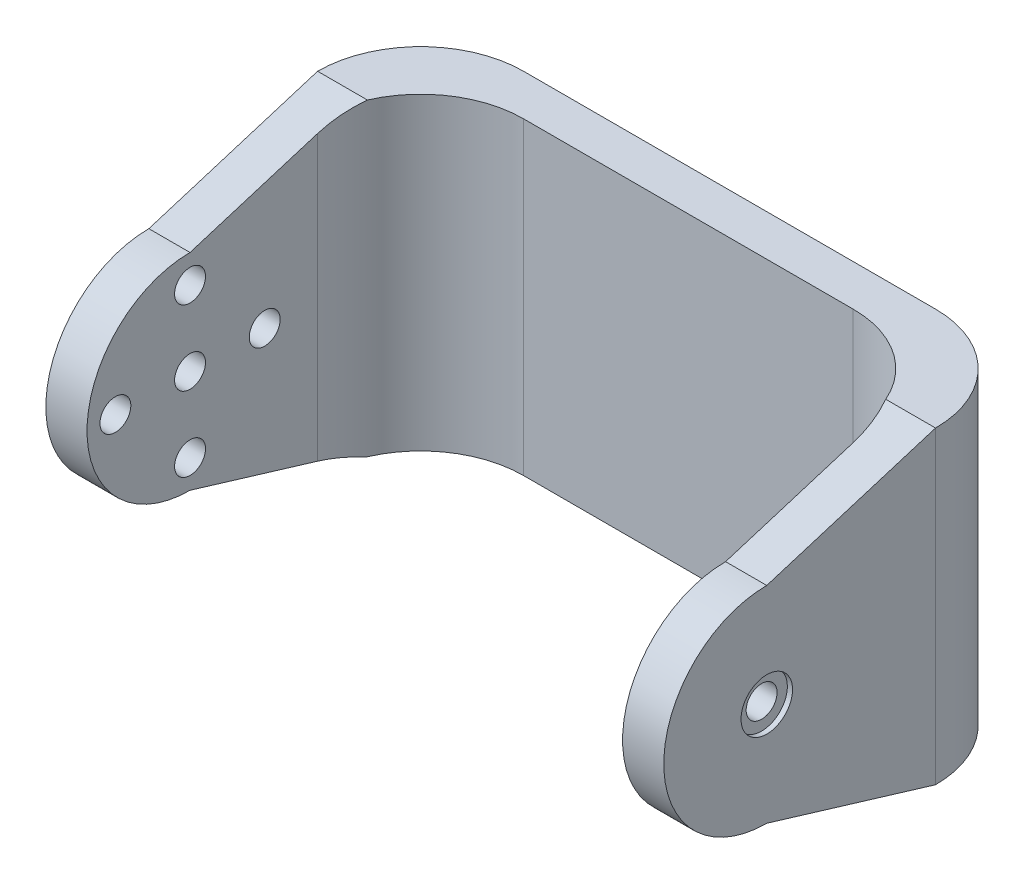
ISO-10303-21;
HEADER;
FILE_DESCRIPTION(('STEP AP214'),'2;1');
FILE_NAME('part.step','',(''),(''),'','','');
FILE_SCHEMA(('AUTOMOTIVE_DESIGN { 1 0 10303 214 1 1 1 1 }'));
ENDSEC;
DATA;
#1=APPLICATION_CONTEXT('core data for automotive mechanical design processes');
#2=APPLICATION_PROTOCOL_DEFINITION('international standard','automotive_design',2000,#1);
#3=PRODUCT_CONTEXT('',#1,'mechanical');
#4=PRODUCT('Part','Part','',(#3));
#5=PRODUCT_RELATED_PRODUCT_CATEGORY('part','',(#4));
#6=PRODUCT_DEFINITION_FORMATION('','',#4);
#7=PRODUCT_DEFINITION_CONTEXT('part definition',#1,'design');
#8=PRODUCT_DEFINITION('design','',#6,#7);
#9=PRODUCT_DEFINITION_SHAPE('','',#8);
#10=(LENGTH_UNIT() NAMED_UNIT(*) SI_UNIT(.MILLI.,.METRE.));
#11=(NAMED_UNIT(*) PLANE_ANGLE_UNIT() SI_UNIT($,.RADIAN.));
#12=(NAMED_UNIT(*) SI_UNIT($,.STERADIAN.) SOLID_ANGLE_UNIT());
#13=UNCERTAINTY_MEASURE_WITH_UNIT(LENGTH_MEASURE(1.E-05),#10,'distance_accuracy_value','');
#14=(GEOMETRIC_REPRESENTATION_CONTEXT(3) GLOBAL_UNCERTAINTY_ASSIGNED_CONTEXT((#13)) GLOBAL_UNIT_ASSIGNED_CONTEXT((#10,
#11,#12)) REPRESENTATION_CONTEXT('',''));
#15=CARTESIAN_POINT('',(0.,0.,0.));
#16=DIRECTION('',(0.,0.,1.));
#17=DIRECTION('',(1.,0.,0.));
#18=AXIS2_PLACEMENT_3D('',#15,#16,#17);
#19=CARTESIAN_POINT('',(19.4462482017696,14.9550555286349,4.24471382344648));
#20=DIRECTION('',(1.,0.,0.));
#21=DIRECTION('',(0.,0.,-1.));
#22=AXIS2_PLACEMENT_3D('',#19,#20,#21);
#23=CYLINDRICAL_SURFACE('',#22,1.5);
#24=CARTESIAN_POINT('',(23.6888888888889,14.9550555286349,4.24471382344647));
#25=DIRECTION('',(1.,0.,0.));
#26=DIRECTION('',(0.,0.,-1.));
#27=AXIS2_PLACEMENT_3D('',#24,#25,#26);
#28=CIRCLE('',#27,1.5);
#29=CARTESIAN_POINT('',(23.6888888888889,14.9550555286349,2.74471382344647));
#30=VERTEX_POINT('',#29);
#31=EDGE_CURVE('E257',#30,#30,#28,.F.);
#32=ORIENTED_EDGE('',*,*,#31,.T.);
#33=EDGE_LOOP('',(#32));
#34=FACE_BOUND('',#33,.T.);
#35=CARTESIAN_POINT('',(27.1888888888889,14.9550555286349,4.24471382344647));
#36=DIRECTION('',(1.,0.,0.));
#37=DIRECTION('',(0.,0.,-1.));
#38=AXIS2_PLACEMENT_3D('',#35,#36,#37);
#39=CIRCLE('',#38,1.5);
#40=CARTESIAN_POINT('',(27.1888888888889,14.9550555286349,2.74471382344647));
#41=VERTEX_POINT('',#40);
#42=EDGE_CURVE('E41',#41,#41,#39,.F.);
#43=ORIENTED_EDGE('',*,*,#42,.F.);
#44=EDGE_LOOP('',(#43));
#45=FACE_BOUND('',#44,.T.);
#46=ADVANCED_FACE('F37',(#34,#45),#23,.F.);
#47=CARTESIAN_POINT('',(27.6888888888889,30.,-22.1422222222222));
#48=DIRECTION('',(-1.,0.,0.));
#49=DIRECTION('',(0.,0.,1.));
#50=AXIS2_PLACEMENT_3D('',#47,#48,#49);
#51=PLANE('',#50);
#52=CARTESIAN_POINT('',(27.6888888888889,14.9550555286349,4.24471382344647));
#53=DIRECTION('',(1.,0.,0.));
#54=DIRECTION('',(0.,0.,-1.));
#55=AXIS2_PLACEMENT_3D('',#52,#53,#54);
#56=CIRCLE('',#55,2.5);
#57=CARTESIAN_POINT('',(27.6888888888889,14.9550555286349,1.74471382344647));
#58=VERTEX_POINT('',#57);
#59=EDGE_CURVE('E330',#58,#58,#56,.T.);
#60=ORIENTED_EDGE('',*,*,#59,.F.);
#61=EDGE_LOOP('',(#60));
#62=FACE_BOUND('',#61,.T.);
#63=CARTESIAN_POINT('',(27.6888888888889,14.9550555286349,4.24471382344647));
#64=DIRECTION('',(1.,0.,0.));
#65=DIRECTION('',(0.,0.,1.));
#66=AXIS2_PLACEMENT_3D('',#63,#64,#65);
#67=CIRCLE('',#66,10.);
#68=CARTESIAN_POINT('',(27.6888888888889,24.9550555286349,4.24471382344647));
#69=VERTEX_POINT('',#68);
#70=CARTESIAN_POINT('',(27.6888888888889,4.95505552863485,4.24471382344647));
#71=VERTEX_POINT('',#70);
#72=EDGE_CURVE('E146',#69,#71,#67,.T.);
#73=ORIENTED_EDGE('',*,*,#72,.T.);
#74=DIRECTION('',(0.,-0.289435826143577,-0.957197420882748));
#75=VECTOR('',#74,1.);
#76=CARTESIAN_POINT('',(27.6888888888889,0.,-12.1422222222222));
#77=LINE('',#76,#75);
#78=CARTESIAN_POINT('',(27.6888888888889,0.,-12.1422222222222));
#79=VERTEX_POINT('',#78);
#80=EDGE_CURVE('E167',#71,#79,#77,.T.);
#81=ORIENTED_EDGE('',*,*,#80,.T.);
#82=DIRECTION('',(0.,-1.,0.));
#83=VECTOR('',#82,1.);
#84=CARTESIAN_POINT('',(27.6888888888889,30.,-12.1422222222222));
#85=LINE('',#84,#83);
#86=CARTESIAN_POINT('',(27.6888888888889,30.,-12.1422222222222));
#87=VERTEX_POINT('',#86);
#88=EDGE_CURVE('E164',#79,#87,#85,.F.);
#89=ORIENTED_EDGE('',*,*,#88,.T.);
#90=DIRECTION('',(0.,-0.294235574594655,0.955732926419799));
#91=VECTOR('',#90,1.);
#92=CARTESIAN_POINT('',(27.6888888888889,30.,-12.1422222222222));
#93=LINE('',#92,#91);
#94=EDGE_CURVE('E138',#87,#69,#93,.T.);
#95=ORIENTED_EDGE('',*,*,#94,.T.);
#96=EDGE_LOOP('',(#73,#81,#89,#95));
#97=FACE_BOUND('',#96,.T.);
#98=ADVANCED_FACE('F165',(#62,#97),#51,.F.);
#99=CARTESIAN_POINT('',(-32.3111111111111,30.,-22.1422222222222));
#100=DIRECTION('',(0.,0.,1.));
#101=DIRECTION('',(1.,0.,0.));
#102=AXIS2_PLACEMENT_3D('',#99,#100,#101);
#103=PLANE('',#102);
#104=DIRECTION('',(-1.,0.,0.));
#105=VECTOR('',#104,1.);
#106=CARTESIAN_POINT('',(-32.3111111111111,0.,-22.1422222222222));
#107=LINE('',#106,#105);
#108=CARTESIAN_POINT('',(17.6888888888889,0.,-22.1422222222222));
#109=VERTEX_POINT('',#108);
#110=CARTESIAN_POINT('',(-22.3111111111111,0.,-22.1422222222222));
#111=VERTEX_POINT('',#110);
#112=EDGE_CURVE('E229',#109,#111,#107,.T.);
#113=ORIENTED_EDGE('',*,*,#112,.T.);
#114=DIRECTION('',(0.,-1.,0.));
#115=VECTOR('',#114,1.);
#116=CARTESIAN_POINT('',(-22.3111111111111,30.,-22.1422222222222));
#117=LINE('',#116,#115);
#118=CARTESIAN_POINT('',(-22.3111111111111,30.,-22.1422222222222));
#119=VERTEX_POINT('',#118);
#120=EDGE_CURVE('E193',#111,#119,#117,.F.);
#121=ORIENTED_EDGE('',*,*,#120,.T.);
#122=DIRECTION('',(-1.,0.,0.));
#123=VECTOR('',#122,1.);
#124=CARTESIAN_POINT('',(-32.3111111111111,30.,-22.1422222222222));
#125=LINE('',#124,#123);
#126=CARTESIAN_POINT('',(17.6888888888889,30.,-22.1422222222222));
#127=VERTEX_POINT('',#126);
#128=EDGE_CURVE('E228',#127,#119,#125,.T.);
#129=ORIENTED_EDGE('',*,*,#128,.F.);
#130=DIRECTION('',(0.,-1.,0.));
#131=VECTOR('',#130,1.);
#132=CARTESIAN_POINT('',(17.6888888888889,30.,-22.1422222222222));
#133=LINE('',#132,#131);
#134=EDGE_CURVE('E175',#127,#109,#133,.T.);
#135=ORIENTED_EDGE('',*,*,#134,.T.);
#136=EDGE_LOOP('',(#113,#121,#129,#135));
#137=FACE_BOUND('',#136,.T.);
#138=ADVANCED_FACE('F241',(#137),#103,.F.);
#139=CARTESIAN_POINT('',(-32.3111111111111,30.,16.8577777777778));
#140=DIRECTION('',(1.,0.,0.));
#141=DIRECTION('',(0.,0.,-1.));
#142=AXIS2_PLACEMENT_3D('',#139,#140,#141);
#143=PLANE('',#142);
#144=CARTESIAN_POINT('',(-32.3111111111111,14.9560555286349,-3.00628617655362));
#145=DIRECTION('',(-1.,0.,0.));
#146=DIRECTION('',(0.,0.,1.));
#147=AXIS2_PLACEMENT_3D('',#144,#145,#146);
#148=CIRCLE('',#147,1.5);
#149=CARTESIAN_POINT('',(-32.3111111111111,14.9560555286349,-1.50628617655362));
#150=VERTEX_POINT('',#149);
#151=EDGE_CURVE('E290',#150,#150,#148,.T.);
#152=ORIENTED_EDGE('',*,*,#151,.F.);
#153=EDGE_LOOP('',(#152));
#154=FACE_BOUND('',#153,.T.);
#155=CARTESIAN_POINT('',(-32.3111111111111,14.9550555286349,4.24471382344649));
#156=DIRECTION('',(-1.,0.,0.));
#157=DIRECTION('',(0.,0.,1.));
#158=AXIS2_PLACEMENT_3D('',#155,#156,#157);
#159=CIRCLE('',#158,1.5);
#160=CARTESIAN_POINT('',(-32.3111111111111,14.9550555286349,5.74471382344649));
#161=VERTEX_POINT('',#160);
#162=EDGE_CURVE('E289',#161,#161,#159,.T.);
#163=ORIENTED_EDGE('',*,*,#162,.F.);
#164=EDGE_LOOP('',(#163));
#165=FACE_BOUND('',#164,.T.);
#166=CARTESIAN_POINT('',(-32.3111111111111,7.70505552863486,4.24271382344633));
#167=DIRECTION('',(-1.,0.,0.));
#168=DIRECTION('',(0.,0.,1.));
#169=AXIS2_PLACEMENT_3D('',#166,#167,#168);
#170=CIRCLE('',#169,1.5);
#171=CARTESIAN_POINT('',(-32.3111111111111,7.70505552863486,5.74271382344633));
#172=VERTEX_POINT('',#171);
#173=EDGE_CURVE('E296',#172,#172,#170,.T.);
#174=ORIENTED_EDGE('',*,*,#173,.F.);
#175=EDGE_LOOP('',(#174));
#176=FACE_BOUND('',#175,.T.);
#177=CARTESIAN_POINT('',(-32.3111111111111,22.2050555286349,4.24471382344649));
#178=DIRECTION('',(-1.,0.,0.));
#179=DIRECTION('',(0.,0.,1.));
#180=AXIS2_PLACEMENT_3D('',#177,#178,#179);
#181=CIRCLE('',#180,1.5);
#182=CARTESIAN_POINT('',(-32.3111111111111,22.2050555286349,5.74471382344649));
#183=VERTEX_POINT('',#182);
#184=EDGE_CURVE('E303',#183,#183,#181,.T.);
#185=ORIENTED_EDGE('',*,*,#184,.F.);
#186=EDGE_LOOP('',(#185));
#187=FACE_BOUND('',#186,.T.);
#188=CARTESIAN_POINT('',(-32.3111111111111,14.9540555286348,11.4937138234464));
#189=DIRECTION('',(-1.,0.,0.));
#190=DIRECTION('',(0.,0.,1.));
#191=AXIS2_PLACEMENT_3D('',#188,#189,#190);
#192=CIRCLE('',#191,1.5);
#193=CARTESIAN_POINT('',(-32.3111111111111,14.9540555286348,12.9937138234464));
#194=VERTEX_POINT('',#193);
#195=EDGE_CURVE('E308',#194,#194,#192,.T.);
#196=ORIENTED_EDGE('',*,*,#195,.F.);
#197=EDGE_LOOP('',(#196));
#198=FACE_BOUND('',#197,.T.);
#199=DIRECTION('',(0.,-1.,0.));
#200=VECTOR('',#199,1.);
#201=CARTESIAN_POINT('',(-32.3111111111111,30.,-12.1422222222222));
#202=LINE('',#201,#200);
#203=CARTESIAN_POINT('',(-32.3111111111111,30.,-12.1422222222222));
#204=VERTEX_POINT('',#203);
#205=CARTESIAN_POINT('',(-32.3111111111111,0.,-12.1422222222222));
#206=VERTEX_POINT('',#205);
#207=EDGE_CURVE('E188',#204,#206,#202,.T.);
#208=ORIENTED_EDGE('',*,*,#207,.T.);
#209=DIRECTION('',(0.,-0.289435826143577,-0.957197420882748));
#210=VECTOR('',#209,1.);
#211=CARTESIAN_POINT('',(-32.3111111111111,0.,-12.1422222222222));
#212=LINE('',#211,#210);
#213=CARTESIAN_POINT('',(-32.3111111111111,4.95505552863485,4.24471382344648));
#214=VERTEX_POINT('',#213);
#215=EDGE_CURVE('E147',#214,#206,#212,.T.);
#216=ORIENTED_EDGE('',*,*,#215,.F.);
#217=CARTESIAN_POINT('',(-32.3111111111111,14.9550555286349,4.24471382344649));
#218=DIRECTION('',(1.,0.,0.));
#219=DIRECTION('',(0.,0.,1.));
#220=AXIS2_PLACEMENT_3D('',#217,#218,#219);
#221=CIRCLE('',#220,10.);
#222=CARTESIAN_POINT('',(-32.3111111111111,24.9550555286349,4.24471382344648));
#223=VERTEX_POINT('',#222);
#224=EDGE_CURVE('E256',#223,#214,#221,.T.);
#225=ORIENTED_EDGE('',*,*,#224,.F.);
#226=DIRECTION('',(0.,-0.294235574594655,0.955732926419799));
#227=VECTOR('',#226,1.);
#228=CARTESIAN_POINT('',(-32.3111111111111,30.,-12.1422222222222));
#229=LINE('',#228,#227);
#230=EDGE_CURVE('E254',#204,#223,#229,.T.);
#231=ORIENTED_EDGE('',*,*,#230,.F.);
#232=EDGE_LOOP('',(#208,#216,#225,#231));
#233=FACE_BOUND('',#232,.T.);
#234=ADVANCED_FACE('F251',(#154,#165,#176,#187,#198,#233),#143,.F.);
#235=CARTESIAN_POINT('',(-28.3111111111111,30.,-18.1422222222222));
#236=DIRECTION('',(-1.,0.,0.));
#237=DIRECTION('',(0.,0.,1.));
#238=AXIS2_PLACEMENT_3D('',#235,#236,#237);
#239=PLANE('',#238);
#240=CARTESIAN_POINT('',(-28.3111111111111,14.9560555286349,-3.00628617655362));
#241=DIRECTION('',(-1.,0.,0.));
#242=DIRECTION('',(0.,0.,1.));
#243=AXIS2_PLACEMENT_3D('',#240,#241,#242);
#244=CIRCLE('',#243,1.5);
#245=CARTESIAN_POINT('',(-28.3111111111111,14.9560555286349,-1.50628617655362));
#246=VERTEX_POINT('',#245);
#247=EDGE_CURVE('E234',#246,#246,#244,.F.);
#248=ORIENTED_EDGE('',*,*,#247,.F.);
#249=EDGE_LOOP('',(#248));
#250=FACE_BOUND('',#249,.T.);
#251=CARTESIAN_POINT('',(-28.3111111111111,14.9550555286349,4.24471382344648));
#252=DIRECTION('',(-1.,0.,0.));
#253=DIRECTION('',(0.,0.,1.));
#254=AXIS2_PLACEMENT_3D('',#251,#252,#253);
#255=CIRCLE('',#254,1.5);
#256=CARTESIAN_POINT('',(-28.3111111111111,14.9550555286349,5.74471382344649));
#257=VERTEX_POINT('',#256);
#258=EDGE_CURVE('E300',#257,#257,#255,.F.);
#259=ORIENTED_EDGE('',*,*,#258,.F.);
#260=EDGE_LOOP('',(#259));
#261=FACE_BOUND('',#260,.T.);
#262=CARTESIAN_POINT('',(-28.3111111111111,7.70505552863486,4.24271382344633));
#263=DIRECTION('',(-1.,0.,0.));
#264=DIRECTION('',(0.,0.,1.));
#265=AXIS2_PLACEMENT_3D('',#262,#263,#264);
#266=CIRCLE('',#265,1.5);
#267=CARTESIAN_POINT('',(-28.3111111111111,7.70505552863486,5.74271382344633));
#268=VERTEX_POINT('',#267);
#269=EDGE_CURVE('E299',#268,#268,#266,.F.);
#270=ORIENTED_EDGE('',*,*,#269,.F.);
#271=EDGE_LOOP('',(#270));
#272=FACE_BOUND('',#271,.T.);
#273=CARTESIAN_POINT('',(-28.3111111111111,22.2050555286349,4.24471382344648));
#274=DIRECTION('',(-1.,0.,0.));
#275=DIRECTION('',(0.,0.,1.));
#276=AXIS2_PLACEMENT_3D('',#273,#274,#275);
#277=CIRCLE('',#276,1.5);
#278=CARTESIAN_POINT('',(-28.3111111111111,22.2050555286349,5.74471382344649));
#279=VERTEX_POINT('',#278);
#280=EDGE_CURVE('E311',#279,#279,#277,.F.);
#281=ORIENTED_EDGE('',*,*,#280,.F.);
#282=EDGE_LOOP('',(#281));
#283=FACE_BOUND('',#282,.T.);
#284=CARTESIAN_POINT('',(-28.3111111111111,14.9540555286348,11.4937138234464));
#285=DIRECTION('',(-1.,0.,0.));
#286=DIRECTION('',(0.,0.,1.));
#287=AXIS2_PLACEMENT_3D('',#284,#285,#286);
#288=CIRCLE('',#287,1.5);
#289=CARTESIAN_POINT('',(-28.3111111111111,14.9540555286348,12.9937138234464));
#290=VERTEX_POINT('',#289);
#291=EDGE_CURVE('E293',#290,#290,#288,.F.);
#292=ORIENTED_EDGE('',*,*,#291,.F.);
#293=EDGE_LOOP('',(#292));
#294=FACE_BOUND('',#293,.T.);
#295=CARTESIAN_POINT('',(-28.3111111111111,14.9550555286349,4.24471382344648));
#296=DIRECTION('',(-1.,0.,0.));
#297=DIRECTION('',(0.,0.,1.));
#298=AXIS2_PLACEMENT_3D('',#295,#296,#297);
#299=CIRCLE('',#298,10.);
#300=CARTESIAN_POINT('',(-28.3111111111111,24.9550555286349,4.24471382344648));
#301=VERTEX_POINT('',#300);
#302=CARTESIAN_POINT('',(-28.3111111111111,4.95505552863485,4.24471382344648));
#303=VERTEX_POINT('',#302);
#304=EDGE_CURVE('E286',#301,#303,#299,.F.);
#305=ORIENTED_EDGE('',*,*,#304,.T.);
#306=DIRECTION('',(0.,-0.289435826143577,-0.957197420882748));
#307=VECTOR('',#306,1.);
#308=CARTESIAN_POINT('',(-28.3111111111111,0.85090956588825,-9.32816684861875));
#309=LINE('',#308,#307);
#310=CARTESIAN_POINT('',(-28.3111111111111,1.20951360640589,-8.14222222222222));
#311=VERTEX_POINT('',#310);
#312=EDGE_CURVE('E278',#303,#311,#309,.T.);
#313=ORIENTED_EDGE('',*,*,#312,.T.);
#314=DIRECTION('',(0.,-1.,0.));
#315=VECTOR('',#314,1.);
#316=CARTESIAN_POINT('',(-28.3111111111111,30.,-8.14222222222222));
#317=LINE('',#316,#315);
#318=CARTESIAN_POINT('',(-28.3111111111111,28.768544782916,-8.14222222222222));
#319=VERTEX_POINT('',#318);
#320=EDGE_CURVE('E200',#311,#319,#317,.F.);
#321=ORIENTED_EDGE('',*,*,#320,.T.);
#322=DIRECTION('',(0.,-0.294235574594655,0.955732926419799));
#323=VECTOR('',#322,1.);
#324=CARTESIAN_POINT('',(-28.3111111111111,31.687263760585,-17.6227747820799));
#325=LINE('',#324,#323);
#326=EDGE_CURVE('E61',#319,#301,#325,.T.);
#327=ORIENTED_EDGE('',*,*,#326,.T.);
#328=EDGE_LOOP('',(#305,#313,#321,#327));
#329=FACE_BOUND('',#328,.T.);
#330=ADVANCED_FACE('F393',(#250,#261,#272,#283,#294,#329),#239,.F.);
#331=CARTESIAN_POINT('',(23.6888888888889,30.,-18.1422222222222));
#332=DIRECTION('',(0.,0.,-1.));
#333=DIRECTION('',(-1.,0.,0.));
#334=AXIS2_PLACEMENT_3D('',#331,#332,#333);
#335=PLANE('',#334);
#336=DIRECTION('',(1.,0.,0.));
#337=VECTOR('',#336,1.);
#338=CARTESIAN_POINT('',(23.6888888888889,30.,-18.1422222222222));
#339=LINE('',#338,#337);
#340=CARTESIAN_POINT('',(-18.3111111111111,30.,-18.1422222222222));
#341=VERTEX_POINT('',#340);
#342=CARTESIAN_POINT('',(13.6888888888889,30.,-18.1422222222222));
#343=VERTEX_POINT('',#342);
#344=EDGE_CURVE('E231',#341,#343,#339,.T.);
#345=ORIENTED_EDGE('',*,*,#344,.F.);
#346=DIRECTION('',(0.,-1.,0.));
#347=VECTOR('',#346,1.);
#348=CARTESIAN_POINT('',(-18.3111111111111,0.,-18.1422222222222));
#349=LINE('',#348,#347);
#350=CARTESIAN_POINT('',(-18.3111111111111,0.,-18.1422222222222));
#351=VERTEX_POINT('',#350);
#352=EDGE_CURVE('E197',#341,#351,#349,.T.);
#353=ORIENTED_EDGE('',*,*,#352,.T.);
#354=DIRECTION('',(1.,0.,0.));
#355=VECTOR('',#354,1.);
#356=CARTESIAN_POINT('',(23.6888888888889,0.,-18.1422222222222));
#357=LINE('',#356,#355);
#358=CARTESIAN_POINT('',(13.6888888888889,0.,-18.1422222222222));
#359=VERTEX_POINT('',#358);
#360=EDGE_CURVE('E223',#351,#359,#357,.T.);
#361=ORIENTED_EDGE('',*,*,#360,.T.);
#362=DIRECTION('',(0.,-1.,0.));
#363=VECTOR('',#362,1.);
#364=CARTESIAN_POINT('',(13.6888888888889,30.,-18.1422222222222));
#365=LINE('',#364,#363);
#366=EDGE_CURVE('E179',#359,#343,#365,.F.);
#367=ORIENTED_EDGE('',*,*,#366,.T.);
#368=EDGE_LOOP('',(#345,#353,#361,#367));
#369=FACE_BOUND('',#368,.T.);
#370=ADVANCED_FACE('F319',(#369),#335,.F.);
#371=CARTESIAN_POINT('',(23.6888888888889,30.,16.8577777777778));
#372=DIRECTION('',(1.,0.,0.));
#373=DIRECTION('',(0.,0.,-1.));
#374=AXIS2_PLACEMENT_3D('',#371,#372,#373);
#375=PLANE('',#374);
#376=ORIENTED_EDGE('',*,*,#31,.F.);
#377=EDGE_LOOP('',(#376));
#378=FACE_BOUND('',#377,.T.);
#379=DIRECTION('',(0.,-1.,0.));
#380=VECTOR('',#379,1.);
#381=CARTESIAN_POINT('',(23.6888888888889,0.,-8.14222222222222));
#382=LINE('',#381,#380);
#383=CARTESIAN_POINT('',(23.6888888888889,28.768544782916,-8.14222222222222));
#384=VERTEX_POINT('',#383);
#385=CARTESIAN_POINT('',(23.6888888888889,1.20951360640589,-8.14222222222222));
#386=VERTEX_POINT('',#385);
#387=EDGE_CURVE('E176',#384,#386,#382,.T.);
#388=ORIENTED_EDGE('',*,*,#387,.T.);
#389=DIRECTION('',(0.,0.289435826143577,0.957197420882748));
#390=VECTOR('',#389,1.);
#391=CARTESIAN_POINT('',(23.6888888888889,10.5475624862377,22.7397747404417));
#392=LINE('',#391,#390);
#393=CARTESIAN_POINT('',(23.6888888888889,4.95505552863485,4.24471382344647));
#394=VERTEX_POINT('',#393);
#395=EDGE_CURVE('E283',#386,#394,#392,.T.);
#396=ORIENTED_EDGE('',*,*,#395,.T.);
#397=CARTESIAN_POINT('',(23.6888888888889,14.9550555286349,4.24471382344648));
#398=DIRECTION('',(1.,0.,0.));
#399=DIRECTION('',(0.,0.,-1.));
#400=AXIS2_PLACEMENT_3D('',#397,#398,#399);
#401=CIRCLE('',#400,10.);
#402=CARTESIAN_POINT('',(23.6888888888889,24.9550555286349,4.24471382344647));
#403=VERTEX_POINT('',#402);
#404=EDGE_CURVE('E11',#394,#403,#401,.F.);
#405=ORIENTED_EDGE('',*,*,#404,.T.);
#406=DIRECTION('',(0.,0.294235574594655,-0.955732926419799));
#407=VECTOR('',#406,1.);
#408=CARTESIAN_POINT('',(23.6888888888889,21.8448918238393,14.3471151504234));
#409=LINE('',#408,#407);
#410=EDGE_CURVE('E275',#403,#384,#409,.T.);
#411=ORIENTED_EDGE('',*,*,#410,.T.);
#412=EDGE_LOOP('',(#388,#396,#405,#411));
#413=FACE_BOUND('',#412,.T.);
#414=ADVANCED_FACE('F324',(#378,#413),#375,.F.);
#415=CARTESIAN_POINT('',(0.,30.,0.));
#416=DIRECTION('',(0.,-1.,0.));
#417=DIRECTION('',(0.,0.,-1.));
#418=AXIS2_PLACEMENT_3D('',#415,#416,#417);
#419=PLANE('',#418);
#420=CARTESIAN_POINT('',(-22.3111111111111,30.,-12.1422222222222));
#421=DIRECTION('',(0.,-1.,0.));
#422=DIRECTION('',(0.,0.,-1.));
#423=AXIS2_PLACEMENT_3D('',#420,#421,#422);
#424=CIRCLE('',#423,10.);
#425=EDGE_CURVE('E195',#119,#204,#424,.F.);
#426=ORIENTED_EDGE('',*,*,#425,.T.);
#427=DIRECTION('',(-1.,0.,0.));
#428=VECTOR('',#427,1.);
#429=CARTESIAN_POINT('',(27.6888888888889,30.,-12.1422222222222));
#430=LINE('',#429,#428);
#431=CARTESIAN_POINT('',(-27.4762625010227,30.,-12.1422222222222));
#432=VERTEX_POINT('',#431);
#433=EDGE_CURVE('E160',#432,#204,#430,.T.);
#434=ORIENTED_EDGE('',*,*,#433,.F.);
#435=CARTESIAN_POINT('',(-18.3111111111111,30.,-8.14222222222222));
#436=DIRECTION('',(0.,-1.,0.));
#437=DIRECTION('',(0.,0.,-1.));
#438=AXIS2_PLACEMENT_3D('',#435,#436,#437);
#439=CIRCLE('',#438,10.);
#440=EDGE_CURVE('E206',#432,#341,#439,.T.);
#441=ORIENTED_EDGE('',*,*,#440,.T.);
#442=ORIENTED_EDGE('',*,*,#344,.T.);
#443=CARTESIAN_POINT('',(13.6888888888889,30.,-8.14222222222222));
#444=DIRECTION('',(0.,-1.,0.));
#445=DIRECTION('',(0.,0.,-1.));
#446=AXIS2_PLACEMENT_3D('',#443,#444,#445);
#447=CIRCLE('',#446,10.);
#448=CARTESIAN_POINT('',(22.8540402788006,30.,-12.1422222222222));
#449=VERTEX_POINT('',#448);
#450=EDGE_CURVE('E158',#343,#449,#447,.T.);
#451=ORIENTED_EDGE('',*,*,#450,.T.);
#452=EDGE_CURVE('E53',#87,#449,#430,.T.);
#453=ORIENTED_EDGE('',*,*,#452,.F.);
#454=CARTESIAN_POINT('',(17.6888888888889,30.,-12.1422222222222));
#455=DIRECTION('',(0.,-1.,0.));
#456=DIRECTION('',(0.,0.,-1.));
#457=AXIS2_PLACEMENT_3D('',#454,#455,#456);
#458=CIRCLE('',#457,10.);
#459=EDGE_CURVE('E155',#87,#127,#458,.F.);
#460=ORIENTED_EDGE('',*,*,#459,.T.);
#461=ORIENTED_EDGE('',*,*,#128,.T.);
#462=EDGE_LOOP('',(#426,#434,#441,#442,#451,#453,#460,#461));
#463=FACE_BOUND('',#462,.T.);
#464=ADVANCED_FACE('F152',(#463),#419,.F.);
#465=CARTESIAN_POINT('',(0.,0.,0.));
#466=DIRECTION('',(0.,-1.,0.));
#467=DIRECTION('',(0.,0.,-1.));
#468=AXIS2_PLACEMENT_3D('',#465,#466,#467);
#469=PLANE('',#468);
#470=DIRECTION('',(-1.,0.,0.));
#471=VECTOR('',#470,1.);
#472=CARTESIAN_POINT('',(27.6888888888889,0.,-12.1422222222222));
#473=LINE('',#472,#471);
#474=CARTESIAN_POINT('',(-27.4762625010227,0.,-12.1422222222222));
#475=VERTEX_POINT('',#474);
#476=EDGE_CURVE('E220',#475,#206,#473,.T.);
#477=ORIENTED_EDGE('',*,*,#476,.T.);
#478=CARTESIAN_POINT('',(-22.3111111111111,0.,-12.1422222222222));
#479=DIRECTION('',(0.,-1.,0.));
#480=DIRECTION('',(0.,0.,-1.));
#481=AXIS2_PLACEMENT_3D('',#478,#479,#480);
#482=CIRCLE('',#481,10.);
#483=EDGE_CURVE('E191',#206,#111,#482,.T.);
#484=ORIENTED_EDGE('',*,*,#483,.T.);
#485=ORIENTED_EDGE('',*,*,#112,.F.);
#486=CARTESIAN_POINT('',(17.6888888888889,0.,-12.1422222222222));
#487=DIRECTION('',(0.,-1.,0.));
#488=DIRECTION('',(0.,0.,-1.));
#489=AXIS2_PLACEMENT_3D('',#486,#487,#488);
#490=CIRCLE('',#489,10.);
#491=EDGE_CURVE('E170',#109,#79,#490,.T.);
#492=ORIENTED_EDGE('',*,*,#491,.T.);
#493=CARTESIAN_POINT('',(22.8540402788006,0.,-12.1422222222222));
#494=VERTEX_POINT('',#493);
#495=EDGE_CURVE('E239',#79,#494,#473,.T.);
#496=ORIENTED_EDGE('',*,*,#495,.T.);
#497=CARTESIAN_POINT('',(13.6888888888889,0.,-8.14222222222222));
#498=DIRECTION('',(0.,-1.,0.));
#499=DIRECTION('',(0.,0.,-1.));
#500=AXIS2_PLACEMENT_3D('',#497,#498,#499);
#501=CIRCLE('',#500,10.);
#502=EDGE_CURVE('E185',#494,#359,#501,.F.);
#503=ORIENTED_EDGE('',*,*,#502,.T.);
#504=ORIENTED_EDGE('',*,*,#360,.F.);
#505=CARTESIAN_POINT('',(-18.3111111111111,0.,-8.14222222222222));
#506=DIRECTION('',(0.,-1.,0.));
#507=DIRECTION('',(0.,0.,-1.));
#508=AXIS2_PLACEMENT_3D('',#505,#506,#507);
#509=CIRCLE('',#508,10.);
#510=EDGE_CURVE('E203',#351,#475,#509,.F.);
#511=ORIENTED_EDGE('',*,*,#510,.T.);
#512=EDGE_LOOP('',(#477,#484,#485,#492,#496,#503,#504,#511));
#513=FACE_BOUND('',#512,.T.);
#514=ADVANCED_FACE('F219',(#513),#469,.T.);
#515=CARTESIAN_POINT('',(17.6888888888889,30.,-12.1422222222222));
#516=DIRECTION('',(0.,-1.,0.));
#517=DIRECTION('',(0.,0.,-1.));
#518=AXIS2_PLACEMENT_3D('',#515,#516,#517);
#519=CYLINDRICAL_SURFACE('',#518,10.);
#520=ORIENTED_EDGE('',*,*,#459,.F.);
#521=ORIENTED_EDGE('',*,*,#88,.F.);
#522=ORIENTED_EDGE('',*,*,#491,.F.);
#523=ORIENTED_EDGE('',*,*,#134,.F.);
#524=EDGE_LOOP('',(#520,#521,#522,#523));
#525=FACE_BOUND('',#524,.T.);
#526=ADVANCED_FACE('F173',(#525),#519,.T.);
#527=CARTESIAN_POINT('',(13.6888888888889,30.,-8.14222222222222));
#528=DIRECTION('',(0.,1.,0.));
#529=DIRECTION('',(0.,0.,1.));
#530=AXIS2_PLACEMENT_3D('',#527,#528,#529);
#531=CYLINDRICAL_SURFACE('',#530,10.);
#532=ORIENTED_EDGE('',*,*,#502,.F.);
#533=CARTESIAN_POINT('',(13.6888888888889,1.20951360640589,-8.14222222222222));
#534=DIRECTION('',(0.,0.957197420882748,-0.289435826143577));
#535=DIRECTION('',(0.,0.289435826143577,0.957197420882748));
#536=AXIS2_PLACEMENT_3D('',#533,#534,#535);
#537=ELLIPSE('',#536,10.4471656335824,10.);
#538=EDGE_CURVE('E280',#494,#386,#537,.F.);
#539=ORIENTED_EDGE('',*,*,#538,.T.);
#540=ORIENTED_EDGE('',*,*,#387,.F.);
#541=CARTESIAN_POINT('',(13.6888888888889,28.768544782916,-8.14222222222222));
#542=DIRECTION('',(0.,-0.955732926419799,-0.294235574594655));
#543=DIRECTION('',(0.,0.294235574594655,-0.955732926419799));
#544=AXIS2_PLACEMENT_3D('',#541,#542,#543);
#545=ELLIPSE('',#544,10.4631740976637,10.);
#546=EDGE_CURVE('E273',#384,#449,#545,.F.);
#547=ORIENTED_EDGE('',*,*,#546,.T.);
#548=ORIENTED_EDGE('',*,*,#450,.F.);
#549=ORIENTED_EDGE('',*,*,#366,.F.);
#550=EDGE_LOOP('',(#532,#539,#540,#547,#548,#549));
#551=FACE_BOUND('',#550,.T.);
#552=ADVANCED_FACE('F321',(#551),#531,.F.);
#553=CARTESIAN_POINT('',(-22.3111111111111,30.,-12.1422222222222));
#554=DIRECTION('',(0.,-1.,0.));
#555=DIRECTION('',(0.,0.,-1.));
#556=AXIS2_PLACEMENT_3D('',#553,#554,#555);
#557=CYLINDRICAL_SURFACE('',#556,10.);
#558=ORIENTED_EDGE('',*,*,#425,.F.);
#559=ORIENTED_EDGE('',*,*,#120,.F.);
#560=ORIENTED_EDGE('',*,*,#483,.F.);
#561=ORIENTED_EDGE('',*,*,#207,.F.);
#562=EDGE_LOOP('',(#558,#559,#560,#561));
#563=FACE_BOUND('',#562,.T.);
#564=ADVANCED_FACE('F247',(#563),#557,.T.);
#565=CARTESIAN_POINT('',(-18.3111111111111,30.,-8.14222222222222));
#566=DIRECTION('',(0.,1.,0.));
#567=DIRECTION('',(0.,0.,1.));
#568=AXIS2_PLACEMENT_3D('',#565,#566,#567);
#569=CYLINDRICAL_SURFACE('',#568,10.);
#570=ORIENTED_EDGE('',*,*,#320,.F.);
#571=CARTESIAN_POINT('',(-18.3111111111111,1.20951360640589,-8.14222222222222));
#572=DIRECTION('',(0.,0.957197420882748,-0.289435826143577));
#573=DIRECTION('',(0.,0.289435826143577,0.957197420882748));
#574=AXIS2_PLACEMENT_3D('',#571,#572,#573);
#575=ELLIPSE('',#574,10.4471656335824,10.);
#576=EDGE_CURVE('E46',#311,#475,#575,.F.);
#577=ORIENTED_EDGE('',*,*,#576,.T.);
#578=ORIENTED_EDGE('',*,*,#510,.F.);
#579=ORIENTED_EDGE('',*,*,#352,.F.);
#580=ORIENTED_EDGE('',*,*,#440,.F.);
#581=CARTESIAN_POINT('',(-18.3111111111111,28.768544782916,-8.14222222222222));
#582=DIRECTION('',(0.,-0.955732926419799,-0.294235574594655));
#583=DIRECTION('',(0.,0.294235574594655,-0.955732926419799));
#584=AXIS2_PLACEMENT_3D('',#581,#582,#583);
#585=ELLIPSE('',#584,10.4631740976637,10.);
#586=EDGE_CURVE('E208',#432,#319,#585,.F.);
#587=ORIENTED_EDGE('',*,*,#586,.T.);
#588=EDGE_LOOP('',(#570,#577,#578,#579,#580,#587));
#589=FACE_BOUND('',#588,.T.);
#590=ADVANCED_FACE('F39',(#589),#569,.F.);
#591=CARTESIAN_POINT('',(-24.0684704239918,14.9540555286348,11.4937138234464));
#592=DIRECTION('',(-1.,0.,0.));
#593=DIRECTION('',(0.,0.,1.));
#594=AXIS2_PLACEMENT_3D('',#591,#592,#593);
#595=CYLINDRICAL_SURFACE('',#594,1.5);
#596=ORIENTED_EDGE('',*,*,#291,.T.);
#597=EDGE_LOOP('',(#596));
#598=FACE_BOUND('',#597,.T.);
#599=ORIENTED_EDGE('',*,*,#195,.T.);
#600=EDGE_LOOP('',(#599));
#601=FACE_BOUND('',#600,.T.);
#602=ADVANCED_FACE('F377',(#598,#601),#595,.F.);
#603=CARTESIAN_POINT('',(-24.0684704239918,22.2050555286349,4.24471382344648));
#604=DIRECTION('',(-1.,0.,0.));
#605=DIRECTION('',(0.,0.,1.));
#606=AXIS2_PLACEMENT_3D('',#603,#604,#605);
#607=CYLINDRICAL_SURFACE('',#606,1.5);
#608=ORIENTED_EDGE('',*,*,#280,.T.);
#609=EDGE_LOOP('',(#608));
#610=FACE_BOUND('',#609,.T.);
#611=ORIENTED_EDGE('',*,*,#184,.T.);
#612=EDGE_LOOP('',(#611));
#613=FACE_BOUND('',#612,.T.);
#614=ADVANCED_FACE('F372',(#610,#613),#607,.F.);
#615=CARTESIAN_POINT('',(-24.0684704239918,7.70505552863486,4.24271382344633));
#616=DIRECTION('',(-1.,0.,0.));
#617=DIRECTION('',(0.,0.,1.));
#618=AXIS2_PLACEMENT_3D('',#615,#616,#617);
#619=CYLINDRICAL_SURFACE('',#618,1.5);
#620=ORIENTED_EDGE('',*,*,#269,.T.);
#621=EDGE_LOOP('',(#620));
#622=FACE_BOUND('',#621,.T.);
#623=ORIENTED_EDGE('',*,*,#173,.T.);
#624=EDGE_LOOP('',(#623));
#625=FACE_BOUND('',#624,.T.);
#626=ADVANCED_FACE('F369',(#622,#625),#619,.F.);
#627=CARTESIAN_POINT('',(-24.0684704239918,14.9550555286349,4.24471382344648));
#628=DIRECTION('',(-1.,0.,0.));
#629=DIRECTION('',(0.,0.,1.));
#630=AXIS2_PLACEMENT_3D('',#627,#628,#629);
#631=CYLINDRICAL_SURFACE('',#630,1.5);
#632=ORIENTED_EDGE('',*,*,#258,.T.);
#633=EDGE_LOOP('',(#632));
#634=FACE_BOUND('',#633,.T.);
#635=ORIENTED_EDGE('',*,*,#162,.T.);
#636=EDGE_LOOP('',(#635));
#637=FACE_BOUND('',#636,.T.);
#638=ADVANCED_FACE('F367',(#634,#637),#631,.F.);
#639=CARTESIAN_POINT('',(-24.0684704239918,14.9560555286349,-3.00628617655362));
#640=DIRECTION('',(-1.,0.,0.));
#641=DIRECTION('',(0.,0.,1.));
#642=AXIS2_PLACEMENT_3D('',#639,#640,#641);
#643=CYLINDRICAL_SURFACE('',#642,1.5);
#644=ORIENTED_EDGE('',*,*,#247,.T.);
#645=EDGE_LOOP('',(#644));
#646=FACE_BOUND('',#645,.T.);
#647=ORIENTED_EDGE('',*,*,#151,.T.);
#648=EDGE_LOOP('',(#647));
#649=FACE_BOUND('',#648,.T.);
#650=ADVANCED_FACE('F364',(#646,#649),#643,.F.);
#651=CARTESIAN_POINT('',(27.6888888888889,0.,-12.1422222222222));
#652=DIRECTION('',(0.,0.957197420882748,-0.289435826143577));
#653=DIRECTION('',(0.,0.289435826143577,0.957197420882748));
#654=AXIS2_PLACEMENT_3D('',#651,#652,#653);
#655=PLANE('',#654);
#656=DIRECTION('',(-1.,0.,0.));
#657=VECTOR('',#656,1.);
#658=CARTESIAN_POINT('',(27.6888888888889,4.95505552863485,4.24471382344647));
#659=LINE('',#658,#657);
#660=EDGE_CURVE('E270',#303,#214,#659,.T.);
#661=ORIENTED_EDGE('',*,*,#660,.T.);
#662=ORIENTED_EDGE('',*,*,#215,.T.);
#663=ORIENTED_EDGE('',*,*,#476,.F.);
#664=ORIENTED_EDGE('',*,*,#576,.F.);
#665=ORIENTED_EDGE('',*,*,#312,.F.);
#666=EDGE_LOOP('',(#661,#662,#663,#664,#665));
#667=FACE_BOUND('',#666,.T.);
#668=ADVANCED_FACE('F356',(#667),#655,.F.);
#669=CARTESIAN_POINT('',(27.6888888888889,30.,-12.1422222222222));
#670=DIRECTION('',(0.,-0.955732926419799,-0.294235574594655));
#671=DIRECTION('',(0.,0.294235574594655,-0.955732926419799));
#672=AXIS2_PLACEMENT_3D('',#669,#670,#671);
#673=PLANE('',#672);
#674=ORIENTED_EDGE('',*,*,#586,.F.);
#675=ORIENTED_EDGE('',*,*,#433,.T.);
#676=ORIENTED_EDGE('',*,*,#230,.T.);
#677=DIRECTION('',(-1.,0.,0.));
#678=VECTOR('',#677,1.);
#679=CARTESIAN_POINT('',(27.6888888888889,24.9550555286349,4.24471382344647));
#680=LINE('',#679,#678);
#681=EDGE_CURVE('E159',#301,#223,#680,.T.);
#682=ORIENTED_EDGE('',*,*,#681,.F.);
#683=ORIENTED_EDGE('',*,*,#326,.F.);
#684=EDGE_LOOP('',(#674,#675,#676,#682,#683));
#685=FACE_BOUND('',#684,.T.);
#686=ADVANCED_FACE('F360',(#685),#673,.F.);
#687=CARTESIAN_POINT('',(27.6888888888889,14.9550555286349,4.24471382344647));
#688=DIRECTION('',(-1.,0.,0.));
#689=DIRECTION('',(0.,0.,1.));
#690=AXIS2_PLACEMENT_3D('',#687,#688,#689);
#691=CYLINDRICAL_SURFACE('',#690,10.);
#692=ORIENTED_EDGE('',*,*,#681,.T.);
#693=ORIENTED_EDGE('',*,*,#224,.T.);
#694=ORIENTED_EDGE('',*,*,#660,.F.);
#695=ORIENTED_EDGE('',*,*,#304,.F.);
#696=EDGE_LOOP('',(#692,#693,#694,#695));
#697=FACE_BOUND('',#696,.T.);
#698=ADVANCED_FACE('F357',(#697),#691,.T.);
#699=EDGE_CURVE('E267',#71,#394,#659,.T.);
#700=ORIENTED_EDGE('',*,*,#699,.F.);
#701=ORIENTED_EDGE('',*,*,#72,.F.);
#702=EDGE_CURVE('E141',#69,#403,#680,.T.);
#703=ORIENTED_EDGE('',*,*,#702,.T.);
#704=ORIENTED_EDGE('',*,*,#404,.F.);
#705=EDGE_LOOP('',(#700,#701,#703,#704));
#706=FACE_BOUND('',#705,.T.);
#707=ADVANCED_FACE('F326',(#706),#691,.T.);
#708=ORIENTED_EDGE('',*,*,#538,.F.);
#709=ORIENTED_EDGE('',*,*,#495,.F.);
#710=ORIENTED_EDGE('',*,*,#80,.F.);
#711=ORIENTED_EDGE('',*,*,#699,.T.);
#712=ORIENTED_EDGE('',*,*,#395,.F.);
#713=EDGE_LOOP('',(#708,#709,#710,#711,#712));
#714=FACE_BOUND('',#713,.T.);
#715=ADVANCED_FACE('F328',(#714),#655,.F.);
#716=ORIENTED_EDGE('',*,*,#702,.F.);
#717=ORIENTED_EDGE('',*,*,#94,.F.);
#718=ORIENTED_EDGE('',*,*,#452,.T.);
#719=ORIENTED_EDGE('',*,*,#546,.F.);
#720=ORIENTED_EDGE('',*,*,#410,.F.);
#721=EDGE_LOOP('',(#716,#717,#718,#719,#720));
#722=FACE_BOUND('',#721,.T.);
#723=ADVANCED_FACE('F139',(#722),#673,.F.);
#724=CARTESIAN_POINT('',(27.1888888888889,14.9550555286349,4.24471382344647));
#725=DIRECTION('',(1.,0.,0.));
#726=DIRECTION('',(0.,0.,-1.));
#727=AXIS2_PLACEMENT_3D('',#724,#725,#726);
#728=PLANE('',#727);
#729=CARTESIAN_POINT('',(27.1888888888889,14.9550555286349,4.24471382344647));
#730=DIRECTION('',(1.,0.,0.));
#731=DIRECTION('',(0.,0.,-1.));
#732=AXIS2_PLACEMENT_3D('',#729,#730,#731);
#733=CIRCLE('',#732,2.5);
#734=CARTESIAN_POINT('',(27.1888888888889,14.9550555286349,1.74471382344647));
#735=VERTEX_POINT('',#734);
#736=EDGE_CURVE('E333',#735,#735,#733,.T.);
#737=ORIENTED_EDGE('',*,*,#736,.T.);
#738=EDGE_LOOP('',(#737));
#739=FACE_BOUND('',#738,.T.);
#740=ORIENTED_EDGE('',*,*,#42,.T.);
#741=EDGE_LOOP('',(#740));
#742=FACE_BOUND('',#741,.T.);
#743=ADVANCED_FACE('F340',(#739,#742),#728,.T.);
#744=CARTESIAN_POINT('',(27.1888888888889,14.9550555286349,4.24471382344647));
#745=DIRECTION('',(1.,0.,0.));
#746=DIRECTION('',(0.,0.,-1.));
#747=AXIS2_PLACEMENT_3D('',#744,#745,#746);
#748=CYLINDRICAL_SURFACE('',#747,2.5);
#749=ORIENTED_EDGE('',*,*,#736,.F.);
#750=EDGE_LOOP('',(#749));
#751=FACE_BOUND('',#750,.T.);
#752=ORIENTED_EDGE('',*,*,#59,.T.);
#753=EDGE_LOOP('',(#752));
#754=FACE_BOUND('',#753,.T.);
#755=ADVANCED_FACE('F352',(#751,#754),#748,.F.);
#756=CLOSED_SHELL('',(#46,#98,#138,#234,#330,#370,#414,#464,#514,#526,#552,#564,#590,#602,#614,
#626,#638,#650,#668,#686,#698,#707,#715,#723,#743,#755));
#757=MANIFOLD_SOLID_BREP('B2',#756);
#758=ADVANCED_BREP_SHAPE_REPRESENTATION('',(#18,#757),#14);
#759=SHAPE_DEFINITION_REPRESENTATION(#9,#758);
ENDSEC;
END-ISO-10303-21;
